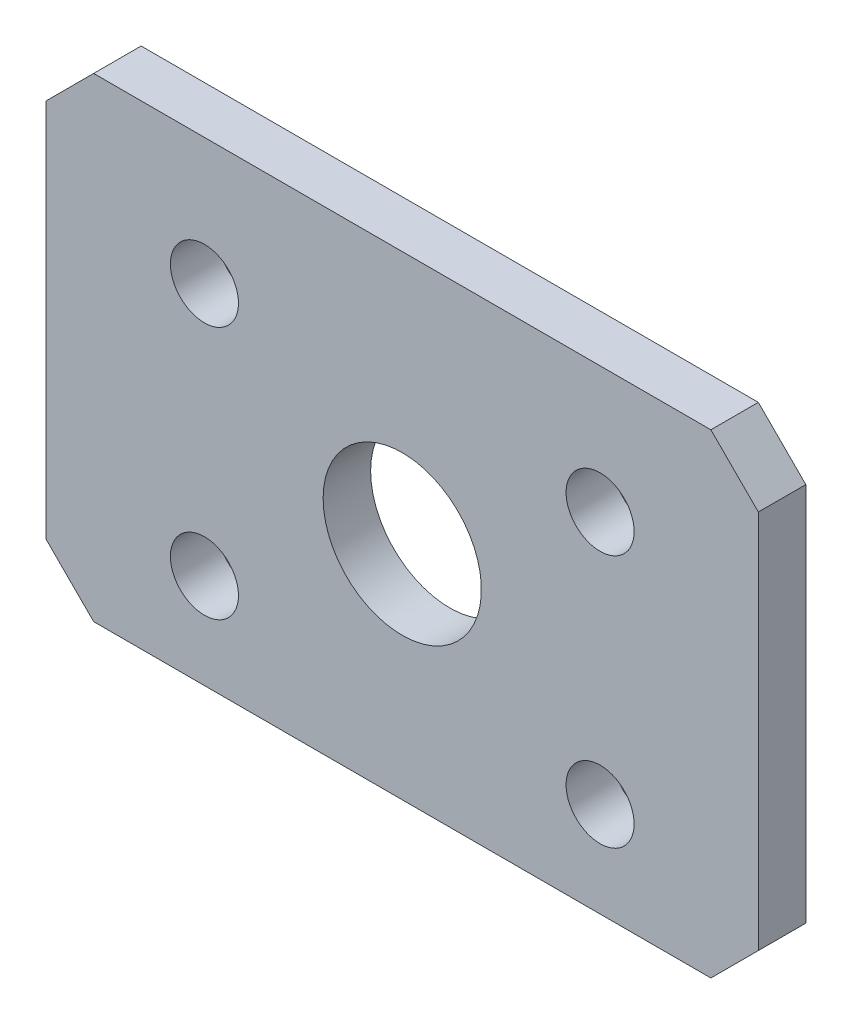
ISO-10303-21;
HEADER;
FILE_DESCRIPTION(('STEP AP214'),'2;1');
FILE_NAME('part.step','',(''),(''),'','','');
FILE_SCHEMA(('AUTOMOTIVE_DESIGN { 1 0 10303 214 1 1 1 1 }'));
ENDSEC;
DATA;
#1=APPLICATION_CONTEXT('core data for automotive mechanical design processes');
#2=APPLICATION_PROTOCOL_DEFINITION('international standard','automotive_design',2000,#1);
#3=PRODUCT_CONTEXT('',#1,'mechanical');
#4=PRODUCT('Part','Part','',(#3));
#5=PRODUCT_RELATED_PRODUCT_CATEGORY('part','',(#4));
#6=PRODUCT_DEFINITION_FORMATION('','',#4);
#7=PRODUCT_DEFINITION_CONTEXT('part definition',#1,'design');
#8=PRODUCT_DEFINITION('design','',#6,#7);
#9=PRODUCT_DEFINITION_SHAPE('','',#8);
#10=(LENGTH_UNIT() NAMED_UNIT(*) SI_UNIT(.MILLI.,.METRE.));
#11=(NAMED_UNIT(*) PLANE_ANGLE_UNIT() SI_UNIT($,.RADIAN.));
#12=(NAMED_UNIT(*) SI_UNIT($,.STERADIAN.) SOLID_ANGLE_UNIT());
#13=UNCERTAINTY_MEASURE_WITH_UNIT(LENGTH_MEASURE(1.E-05),#10,'distance_accuracy_value','');
#14=(GEOMETRIC_REPRESENTATION_CONTEXT(3) GLOBAL_UNCERTAINTY_ASSIGNED_CONTEXT((#13)) GLOBAL_UNIT_ASSIGNED_CONTEXT((#10,
#11,#12)) REPRESENTATION_CONTEXT('',''));
#15=CARTESIAN_POINT('',(0.,0.,0.));
#16=DIRECTION('',(0.,0.,1.));
#17=DIRECTION('',(1.,0.,0.));
#18=AXIS2_PLACEMENT_3D('',#15,#16,#17);
#19=CARTESIAN_POINT('',(0.,0.,0.));
#20=DIRECTION('',(0.,0.,-1.));
#21=DIRECTION('',(-1.,0.,0.));
#22=AXIS2_PLACEMENT_3D('',#19,#20,#21);
#23=PLANE('',#22);
#24=DIRECTION('',(-1.,0.,0.));
#25=VECTOR('',#24,1.);
#26=CARTESIAN_POINT('',(39.,17.,0.));
#27=LINE('',#26,#25);
#28=CARTESIAN_POINT('',(81.,17.,0.));
#29=VERTEX_POINT('',#28);
#30=CARTESIAN_POINT('',(42.,17.,0.));
#31=VERTEX_POINT('',#30);
#32=EDGE_CURVE('E162',#29,#31,#27,.T.);
#33=ORIENTED_EDGE('',*,*,#32,.T.);
#34=DIRECTION('',(0.707106781186548,-0.707106781186547,0.));
#35=VECTOR('',#34,1.);
#36=CARTESIAN_POINT('',(29.4999999999999,29.5,0.));
#37=LINE('',#36,#35);
#38=CARTESIAN_POINT('',(39.,20.,0.));
#39=VERTEX_POINT('',#38);
#40=EDGE_CURVE('E51',#31,#39,#37,.F.);
#41=ORIENTED_EDGE('',*,*,#40,.T.);
#42=DIRECTION('',(0.,-1.,0.));
#43=VECTOR('',#42,1.);
#44=CARTESIAN_POINT('',(39.,0.,0.));
#45=LINE('',#44,#43);
#46=CARTESIAN_POINT('',(39.,44.,0.));
#47=VERTEX_POINT('',#46);
#48=EDGE_CURVE('E161',#47,#39,#45,.T.);
#49=ORIENTED_EDGE('',*,*,#48,.F.);
#50=DIRECTION('',(-0.707106781186544,-0.707106781186551,0.));
#51=VECTOR('',#50,1.);
#52=CARTESIAN_POINT('',(36.4999999999998,41.4999999999998,0.));
#53=LINE('',#52,#51);
#54=CARTESIAN_POINT('',(42.,47.,0.));
#55=VERTEX_POINT('',#54);
#56=EDGE_CURVE('E135',#55,#47,#53,.T.);
#57=ORIENTED_EDGE('',*,*,#56,.F.);
#58=DIRECTION('',(1.,0.,0.));
#59=VECTOR('',#58,1.);
#60=CARTESIAN_POINT('',(78.,47.,0.));
#61=LINE('',#60,#59);
#62=CARTESIAN_POINT('',(81.,47.,0.));
#63=VERTEX_POINT('',#62);
#64=EDGE_CURVE('E207',#55,#63,#61,.T.);
#65=ORIENTED_EDGE('',*,*,#64,.T.);
#66=DIRECTION('',(-0.707106781186551,0.707106781186545,0.));
#67=VECTOR('',#66,1.);
#68=CARTESIAN_POINT('',(103.,25.0000000000002,0.));
#69=LINE('',#68,#67);
#70=CARTESIAN_POINT('',(84.,44.,0.));
#71=VERTEX_POINT('',#70);
#72=EDGE_CURVE('E142',#71,#63,#69,.T.);
#73=ORIENTED_EDGE('',*,*,#72,.F.);
#74=DIRECTION('',(0.,1.,0.));
#75=VECTOR('',#74,1.);
#76=CARTESIAN_POINT('',(84.,47.,0.));
#77=LINE('',#76,#75);
#78=CARTESIAN_POINT('',(84.,20.,0.));
#79=VERTEX_POINT('',#78);
#80=EDGE_CURVE('E164',#79,#71,#77,.T.);
#81=ORIENTED_EDGE('',*,*,#80,.F.);
#82=DIRECTION('',(-0.707106781186547,-0.707106781186548,0.));
#83=VECTOR('',#82,1.);
#84=CARTESIAN_POINT('',(32.0000000000001,-32.,0.));
#85=LINE('',#84,#83);
#86=EDGE_CURVE('E157',#79,#29,#85,.T.);
#87=ORIENTED_EDGE('',*,*,#86,.T.);
#88=EDGE_LOOP('',(#33,#41,#49,#57,#65,#73,#81,#87));
#89=FACE_BOUND('',#88,.T.);
#90=CARTESIAN_POINT('',(49.,23.,0.));
#91=DIRECTION('',(0.,0.,1.));
#92=DIRECTION('',(1.,0.,0.));
#93=AXIS2_PLACEMENT_3D('',#90,#91,#92);
#94=CIRCLE('',#93,2.15);
#95=CARTESIAN_POINT('',(51.15,23.,0.));
#96=VERTEX_POINT('',#95);
#97=EDGE_CURVE('E196',#96,#96,#94,.T.);
#98=ORIENTED_EDGE('',*,*,#97,.T.);
#99=EDGE_LOOP('',(#98));
#100=FACE_BOUND('',#99,.T.);
#101=CARTESIAN_POINT('',(74.,39.,0.));
#102=DIRECTION('',(0.,0.,1.));
#103=DIRECTION('',(1.,0.,0.));
#104=AXIS2_PLACEMENT_3D('',#101,#102,#103);
#105=CIRCLE('',#104,2.15);
#106=CARTESIAN_POINT('',(76.15,39.,0.));
#107=VERTEX_POINT('',#106);
#108=EDGE_CURVE('E195',#107,#107,#105,.T.);
#109=ORIENTED_EDGE('',*,*,#108,.T.);
#110=EDGE_LOOP('',(#109));
#111=FACE_BOUND('',#110,.T.);
#112=CARTESIAN_POINT('',(74.,23.,0.));
#113=DIRECTION('',(0.,0.,1.));
#114=DIRECTION('',(1.,0.,0.));
#115=AXIS2_PLACEMENT_3D('',#112,#113,#114);
#116=CIRCLE('',#115,2.15);
#117=CARTESIAN_POINT('',(76.15,23.,0.));
#118=VERTEX_POINT('',#117);
#119=EDGE_CURVE('E192',#118,#118,#116,.T.);
#120=ORIENTED_EDGE('',*,*,#119,.T.);
#121=EDGE_LOOP('',(#120));
#122=FACE_BOUND('',#121,.T.);
#123=CARTESIAN_POINT('',(49.,39.,0.));
#124=DIRECTION('',(0.,0.,1.));
#125=DIRECTION('',(1.,0.,0.));
#126=AXIS2_PLACEMENT_3D('',#123,#124,#125);
#127=CIRCLE('',#126,2.15);
#128=CARTESIAN_POINT('',(51.15,39.,0.));
#129=VERTEX_POINT('',#128);
#130=EDGE_CURVE('E165',#129,#129,#127,.T.);
#131=ORIENTED_EDGE('',*,*,#130,.T.);
#132=EDGE_LOOP('',(#131));
#133=FACE_BOUND('',#132,.T.);
#134=CARTESIAN_POINT('',(61.5,31.,0.));
#135=DIRECTION('',(0.,0.,-1.));
#136=DIRECTION('',(-1.,0.,0.));
#137=AXIS2_PLACEMENT_3D('',#134,#135,#136);
#138=CIRCLE('',#137,5.);
#139=CARTESIAN_POINT('',(56.5,31.,0.));
#140=VERTEX_POINT('',#139);
#141=EDGE_CURVE('E204',#140,#140,#138,.T.);
#142=ORIENTED_EDGE('',*,*,#141,.F.);
#143=EDGE_LOOP('',(#142));
#144=FACE_BOUND('',#143,.T.);
#145=ADVANCED_FACE('F42',(#89,#100,#111,#122,#133,#144),#23,.T.);
#146=CARTESIAN_POINT('',(78.,47.,4.));
#147=DIRECTION('',(0.,-1.,0.));
#148=DIRECTION('',(0.,0.,-1.));
#149=AXIS2_PLACEMENT_3D('',#146,#147,#148);
#150=PLANE('',#149);
#151=DIRECTION('',(0.,0.,-1.));
#152=VECTOR('',#151,1.);
#153=CARTESIAN_POINT('',(42.,47.,0.));
#154=LINE('',#153,#152);
#155=CARTESIAN_POINT('',(42.,47.,3.));
#156=VERTEX_POINT('',#155);
#157=EDGE_CURVE('E136',#156,#55,#154,.T.);
#158=ORIENTED_EDGE('',*,*,#157,.F.);
#159=DIRECTION('',(1.,0.,0.));
#160=VECTOR('',#159,1.);
#161=CARTESIAN_POINT('',(78.,47.,3.));
#162=LINE('',#161,#160);
#163=CARTESIAN_POINT('',(81.,47.,3.));
#164=VERTEX_POINT('',#163);
#165=EDGE_CURVE('E115',#156,#164,#162,.T.);
#166=ORIENTED_EDGE('',*,*,#165,.T.);
#167=DIRECTION('',(0.,0.,1.));
#168=VECTOR('',#167,1.);
#169=CARTESIAN_POINT('',(81.,47.,30.));
#170=LINE('',#169,#168);
#171=EDGE_CURVE('E139',#63,#164,#170,.T.);
#172=ORIENTED_EDGE('',*,*,#171,.F.);
#173=ORIENTED_EDGE('',*,*,#64,.F.);
#174=EDGE_LOOP('',(#158,#166,#172,#173));
#175=FACE_BOUND('',#174,.T.);
#176=ADVANCED_FACE('F218',(#175),#150,.F.);
#177=CARTESIAN_POINT('',(61.5,31.,4.));
#178=DIRECTION('',(0.,0.,-1.));
#179=DIRECTION('',(1.,0.,0.));
#180=AXIS2_PLACEMENT_3D('',#177,#178,#179);
#181=CYLINDRICAL_SURFACE('',#180,5.);
#182=CARTESIAN_POINT('',(61.5,31.,3.));
#183=DIRECTION('',(0.,0.,-1.));
#184=DIRECTION('',(-1.,0.,0.));
#185=AXIS2_PLACEMENT_3D('',#182,#183,#184);
#186=CIRCLE('',#185,5.);
#187=CARTESIAN_POINT('',(56.5,31.,3.));
#188=VERTEX_POINT('',#187);
#189=EDGE_CURVE('E188',#188,#188,#186,.T.);
#190=ORIENTED_EDGE('',*,*,#189,.F.);
#191=EDGE_LOOP('',(#190));
#192=FACE_BOUND('',#191,.T.);
#193=ORIENTED_EDGE('',*,*,#141,.T.);
#194=EDGE_LOOP('',(#193));
#195=FACE_BOUND('',#194,.T.);
#196=ADVANCED_FACE('F220',(#192,#195),#181,.F.);
#197=CARTESIAN_POINT('',(84.,47.,30.));
#198=DIRECTION('',(1.,0.,0.));
#199=DIRECTION('',(0.,-1.,0.));
#200=AXIS2_PLACEMENT_3D('',#197,#198,#199);
#201=PLANE('',#200);
#202=DIRECTION('',(0.,1.,0.));
#203=VECTOR('',#202,1.);
#204=CARTESIAN_POINT('',(84.,47.,3.));
#205=LINE('',#204,#203);
#206=CARTESIAN_POINT('',(84.,20.,3.));
#207=VERTEX_POINT('',#206);
#208=CARTESIAN_POINT('',(84.,44.,3.));
#209=VERTEX_POINT('',#208);
#210=EDGE_CURVE('E186',#207,#209,#205,.T.);
#211=ORIENTED_EDGE('',*,*,#210,.F.);
#212=DIRECTION('',(0.,0.,-1.));
#213=VECTOR('',#212,1.);
#214=CARTESIAN_POINT('',(84.,20.,0.));
#215=LINE('',#214,#213);
#216=EDGE_CURVE('E12',#207,#79,#215,.T.);
#217=ORIENTED_EDGE('',*,*,#216,.T.);
#218=ORIENTED_EDGE('',*,*,#80,.T.);
#219=DIRECTION('',(0.,0.,-1.));
#220=VECTOR('',#219,1.);
#221=CARTESIAN_POINT('',(84.,44.,0.));
#222=LINE('',#221,#220);
#223=EDGE_CURVE('E137',#209,#71,#222,.T.);
#224=ORIENTED_EDGE('',*,*,#223,.F.);
#225=EDGE_LOOP('',(#211,#217,#218,#224));
#226=FACE_BOUND('',#225,.T.);
#227=ADVANCED_FACE('F226',(#226),#201,.T.);
#228=CARTESIAN_POINT('',(84.,44.,30.));
#229=DIRECTION('',(0.707106781186544,0.70710678118655,0.));
#230=DIRECTION('',(0.,0.,1.));
#231=AXIS2_PLACEMENT_3D('',#228,#229,#230);
#232=PLANE('',#231);
#233=DIRECTION('',(-0.707106781186551,0.707106781186545,0.));
#234=VECTOR('',#233,1.);
#235=CARTESIAN_POINT('',(84.,44.,3.));
#236=LINE('',#235,#234);
#237=EDGE_CURVE('E184',#209,#164,#236,.T.);
#238=ORIENTED_EDGE('',*,*,#237,.F.);
#239=ORIENTED_EDGE('',*,*,#223,.T.);
#240=ORIENTED_EDGE('',*,*,#72,.T.);
#241=ORIENTED_EDGE('',*,*,#171,.T.);
#242=EDGE_LOOP('',(#238,#239,#240,#241));
#243=FACE_BOUND('',#242,.T.);
#244=ADVANCED_FACE('F214',(#243),#232,.T.);
#245=CARTESIAN_POINT('',(42.,47.,4.));
#246=DIRECTION('',(-0.707106781186551,0.707106781186544,0.));
#247=DIRECTION('',(0.,0.,1.));
#248=AXIS2_PLACEMENT_3D('',#245,#246,#247);
#249=PLANE('',#248);
#250=DIRECTION('',(-0.707106781186544,-0.707106781186551,0.));
#251=VECTOR('',#250,1.);
#252=CARTESIAN_POINT('',(42.,47.,3.));
#253=LINE('',#252,#251);
#254=CARTESIAN_POINT('',(39.,44.,3.));
#255=VERTEX_POINT('',#254);
#256=EDGE_CURVE('E109',#156,#255,#253,.T.);
#257=ORIENTED_EDGE('',*,*,#256,.F.);
#258=ORIENTED_EDGE('',*,*,#157,.T.);
#259=ORIENTED_EDGE('',*,*,#56,.T.);
#260=DIRECTION('',(0.,0.,1.));
#261=VECTOR('',#260,1.);
#262=CARTESIAN_POINT('',(39.,44.,30.));
#263=LINE('',#262,#261);
#264=EDGE_CURVE('E125',#47,#255,#263,.T.);
#265=ORIENTED_EDGE('',*,*,#264,.T.);
#266=EDGE_LOOP('',(#257,#258,#259,#265));
#267=FACE_BOUND('',#266,.T.);
#268=ADVANCED_FACE('F133',(#267),#249,.T.);
#269=CARTESIAN_POINT('',(39.,0.,0.));
#270=DIRECTION('',(1.,0.,0.));
#271=DIRECTION('',(0.,1.,0.));
#272=AXIS2_PLACEMENT_3D('',#269,#270,#271);
#273=PLANE('',#272);
#274=ORIENTED_EDGE('',*,*,#48,.T.);
#275=DIRECTION('',(0.,0.,1.));
#276=VECTOR('',#275,1.);
#277=CARTESIAN_POINT('',(39.,20.,0.));
#278=LINE('',#277,#276);
#279=CARTESIAN_POINT('',(39.,20.,3.));
#280=VERTEX_POINT('',#279);
#281=EDGE_CURVE('E128',#39,#280,#278,.T.);
#282=ORIENTED_EDGE('',*,*,#281,.T.);
#283=DIRECTION('',(0.,-1.,0.));
#284=VECTOR('',#283,1.);
#285=CARTESIAN_POINT('',(39.,17.,3.));
#286=LINE('',#285,#284);
#287=EDGE_CURVE('E113',#255,#280,#286,.T.);
#288=ORIENTED_EDGE('',*,*,#287,.F.);
#289=ORIENTED_EDGE('',*,*,#264,.F.);
#290=EDGE_LOOP('',(#274,#282,#288,#289));
#291=FACE_BOUND('',#290,.T.);
#292=ADVANCED_FACE('F124',(#291),#273,.F.);
#293=CARTESIAN_POINT('',(49.,39.,0.));
#294=DIRECTION('',(0.,0.,1.));
#295=DIRECTION('',(1.,0.,0.));
#296=AXIS2_PLACEMENT_3D('',#293,#294,#295);
#297=CYLINDRICAL_SURFACE('',#296,2.15);
#298=CARTESIAN_POINT('',(49.,39.,3.));
#299=DIRECTION('',(0.,0.,-1.));
#300=DIRECTION('',(-1.,0.,0.));
#301=AXIS2_PLACEMENT_3D('',#298,#299,#300);
#302=CIRCLE('',#301,2.15);
#303=CARTESIAN_POINT('',(46.85,39.,3.));
#304=VERTEX_POINT('',#303);
#305=EDGE_CURVE('E119',#304,#304,#302,.F.);
#306=ORIENTED_EDGE('',*,*,#305,.T.);
#307=EDGE_LOOP('',(#306));
#308=FACE_BOUND('',#307,.T.);
#309=ORIENTED_EDGE('',*,*,#130,.F.);
#310=EDGE_LOOP('',(#309));
#311=FACE_BOUND('',#310,.T.);
#312=ADVANCED_FACE('F256',(#308,#311),#297,.F.);
#313=CARTESIAN_POINT('',(74.,23.,0.));
#314=DIRECTION('',(0.,0.,1.));
#315=DIRECTION('',(1.,0.,0.));
#316=AXIS2_PLACEMENT_3D('',#313,#314,#315);
#317=CYLINDRICAL_SURFACE('',#316,2.15);
#318=CARTESIAN_POINT('',(74.,23.,3.));
#319=DIRECTION('',(0.,0.,-1.));
#320=DIRECTION('',(-1.,0.,0.));
#321=AXIS2_PLACEMENT_3D('',#318,#319,#320);
#322=CIRCLE('',#321,2.15);
#323=CARTESIAN_POINT('',(71.85,23.,3.));
#324=VERTEX_POINT('',#323);
#325=EDGE_CURVE('E178',#324,#324,#322,.F.);
#326=ORIENTED_EDGE('',*,*,#325,.T.);
#327=EDGE_LOOP('',(#326));
#328=FACE_BOUND('',#327,.T.);
#329=ORIENTED_EDGE('',*,*,#119,.F.);
#330=EDGE_LOOP('',(#329));
#331=FACE_BOUND('',#330,.T.);
#332=ADVANCED_FACE('F252',(#328,#331),#317,.F.);
#333=CARTESIAN_POINT('',(74.,39.,0.));
#334=DIRECTION('',(0.,0.,1.));
#335=DIRECTION('',(1.,0.,0.));
#336=AXIS2_PLACEMENT_3D('',#333,#334,#335);
#337=CYLINDRICAL_SURFACE('',#336,2.15);
#338=CARTESIAN_POINT('',(74.,39.,3.));
#339=DIRECTION('',(0.,0.,-1.));
#340=DIRECTION('',(-1.,0.,0.));
#341=AXIS2_PLACEMENT_3D('',#338,#339,#340);
#342=CIRCLE('',#341,2.15);
#343=CARTESIAN_POINT('',(71.85,39.,3.));
#344=VERTEX_POINT('',#343);
#345=EDGE_CURVE('E175',#344,#344,#342,.F.);
#346=ORIENTED_EDGE('',*,*,#345,.T.);
#347=EDGE_LOOP('',(#346));
#348=FACE_BOUND('',#347,.T.);
#349=ORIENTED_EDGE('',*,*,#108,.F.);
#350=EDGE_LOOP('',(#349));
#351=FACE_BOUND('',#350,.T.);
#352=ADVANCED_FACE('F255',(#348,#351),#337,.F.);
#353=CARTESIAN_POINT('',(49.,23.,0.));
#354=DIRECTION('',(0.,0.,1.));
#355=DIRECTION('',(1.,0.,0.));
#356=AXIS2_PLACEMENT_3D('',#353,#354,#355);
#357=CYLINDRICAL_SURFACE('',#356,2.15);
#358=CARTESIAN_POINT('',(49.,23.,3.));
#359=DIRECTION('',(0.,0.,-1.));
#360=DIRECTION('',(-1.,0.,0.));
#361=AXIS2_PLACEMENT_3D('',#358,#359,#360);
#362=CIRCLE('',#361,2.15);
#363=CARTESIAN_POINT('',(46.85,23.,3.));
#364=VERTEX_POINT('',#363);
#365=EDGE_CURVE('E129',#364,#364,#362,.F.);
#366=ORIENTED_EDGE('',*,*,#365,.T.);
#367=EDGE_LOOP('',(#366));
#368=FACE_BOUND('',#367,.T.);
#369=ORIENTED_EDGE('',*,*,#97,.F.);
#370=EDGE_LOOP('',(#369));
#371=FACE_BOUND('',#370,.T.);
#372=ADVANCED_FACE('F249',(#368,#371),#357,.F.);
#373=CARTESIAN_POINT('',(39.,17.,0.));
#374=DIRECTION('',(0.,1.,0.));
#375=DIRECTION('',(0.,0.,1.));
#376=AXIS2_PLACEMENT_3D('',#373,#374,#375);
#377=PLANE('',#376);
#378=DIRECTION('',(1.,0.,0.));
#379=VECTOR('',#378,1.);
#380=CARTESIAN_POINT('',(39.,17.,3.));
#381=LINE('',#380,#379);
#382=CARTESIAN_POINT('',(42.,17.,3.));
#383=VERTEX_POINT('',#382);
#384=CARTESIAN_POINT('',(81.,17.,3.));
#385=VERTEX_POINT('',#384);
#386=EDGE_CURVE('E130',#383,#385,#381,.T.);
#387=ORIENTED_EDGE('',*,*,#386,.F.);
#388=DIRECTION('',(0.,0.,-1.));
#389=VECTOR('',#388,1.);
#390=CARTESIAN_POINT('',(42.,17.,0.));
#391=LINE('',#390,#389);
#392=EDGE_CURVE('E64',#383,#31,#391,.T.);
#393=ORIENTED_EDGE('',*,*,#392,.T.);
#394=ORIENTED_EDGE('',*,*,#32,.F.);
#395=DIRECTION('',(0.,0.,1.));
#396=VECTOR('',#395,1.);
#397=CARTESIAN_POINT('',(81.,17.,3.));
#398=LINE('',#397,#396);
#399=EDGE_CURVE('E153',#29,#385,#398,.T.);
#400=ORIENTED_EDGE('',*,*,#399,.T.);
#401=EDGE_LOOP('',(#387,#393,#394,#400));
#402=FACE_BOUND('',#401,.T.);
#403=ADVANCED_FACE('F169',(#402),#377,.F.);
#404=CARTESIAN_POINT('',(0.,0.,3.));
#405=DIRECTION('',(0.,0.,-1.));
#406=DIRECTION('',(-1.,0.,0.));
#407=AXIS2_PLACEMENT_3D('',#404,#405,#406);
#408=PLANE('',#407);
#409=ORIENTED_EDGE('',*,*,#189,.T.);
#410=EDGE_LOOP('',(#409));
#411=FACE_BOUND('',#410,.T.);
#412=ORIENTED_EDGE('',*,*,#287,.T.);
#413=DIRECTION('',(-0.707106781186548,0.707106781186547,0.));
#414=VECTOR('',#413,1.);
#415=CARTESIAN_POINT('',(39.,20.,3.));
#416=LINE('',#415,#414);
#417=EDGE_CURVE('E151',#280,#383,#416,.F.);
#418=ORIENTED_EDGE('',*,*,#417,.T.);
#419=ORIENTED_EDGE('',*,*,#386,.T.);
#420=DIRECTION('',(0.707106781186547,0.707106781186548,0.));
#421=VECTOR('',#420,1.);
#422=CARTESIAN_POINT('',(81.,17.,3.));
#423=LINE('',#422,#421);
#424=EDGE_CURVE('E149',#385,#207,#423,.T.);
#425=ORIENTED_EDGE('',*,*,#424,.T.);
#426=ORIENTED_EDGE('',*,*,#210,.T.);
#427=ORIENTED_EDGE('',*,*,#237,.T.);
#428=ORIENTED_EDGE('',*,*,#165,.F.);
#429=ORIENTED_EDGE('',*,*,#256,.T.);
#430=EDGE_LOOP('',(#412,#418,#419,#425,#426,#427,#428,#429));
#431=FACE_BOUND('',#430,.T.);
#432=ORIENTED_EDGE('',*,*,#325,.F.);
#433=EDGE_LOOP('',(#432));
#434=FACE_BOUND('',#433,.T.);
#435=ORIENTED_EDGE('',*,*,#365,.F.);
#436=EDGE_LOOP('',(#435));
#437=FACE_BOUND('',#436,.T.);
#438=ORIENTED_EDGE('',*,*,#345,.F.);
#439=EDGE_LOOP('',(#438));
#440=FACE_BOUND('',#439,.T.);
#441=ORIENTED_EDGE('',*,*,#305,.F.);
#442=EDGE_LOOP('',(#441));
#443=FACE_BOUND('',#442,.T.);
#444=ADVANCED_FACE('F111',(#411,#431,#434,#437,#440,#443),#408,.F.);
#445=CARTESIAN_POINT('',(39.,20.,0.));
#446=DIRECTION('',(0.707106781186547,0.707106781186548,0.));
#447=DIRECTION('',(0.,0.,1.));
#448=AXIS2_PLACEMENT_3D('',#445,#446,#447);
#449=PLANE('',#448);
#450=ORIENTED_EDGE('',*,*,#40,.F.);
#451=ORIENTED_EDGE('',*,*,#392,.F.);
#452=ORIENTED_EDGE('',*,*,#417,.F.);
#453=ORIENTED_EDGE('',*,*,#281,.F.);
#454=EDGE_LOOP('',(#450,#451,#452,#453));
#455=FACE_BOUND('',#454,.T.);
#456=ADVANCED_FACE('F167',(#455),#449,.F.);
#457=CARTESIAN_POINT('',(81.,17.,0.));
#458=DIRECTION('',(0.707106781186548,-0.707106781186547,0.));
#459=DIRECTION('',(0.,0.,-1.));
#460=AXIS2_PLACEMENT_3D('',#457,#458,#459);
#461=PLANE('',#460);
#462=ORIENTED_EDGE('',*,*,#86,.F.);
#463=ORIENTED_EDGE('',*,*,#216,.F.);
#464=ORIENTED_EDGE('',*,*,#424,.F.);
#465=ORIENTED_EDGE('',*,*,#399,.F.);
#466=EDGE_LOOP('',(#462,#463,#464,#465));
#467=FACE_BOUND('',#466,.T.);
#468=ADVANCED_FACE('F45',(#467),#461,.T.);
#469=CLOSED_SHELL('',(#145,#176,#196,#227,#244,#268,#292,#312,#332,#352,#372,#403,#444,#456,#468));
#470=MANIFOLD_SOLID_BREP('B2',#469);
#471=ADVANCED_BREP_SHAPE_REPRESENTATION('',(#18,#470),#14);
#472=SHAPE_DEFINITION_REPRESENTATION(#9,#471);
ENDSEC;
END-ISO-10303-21;
